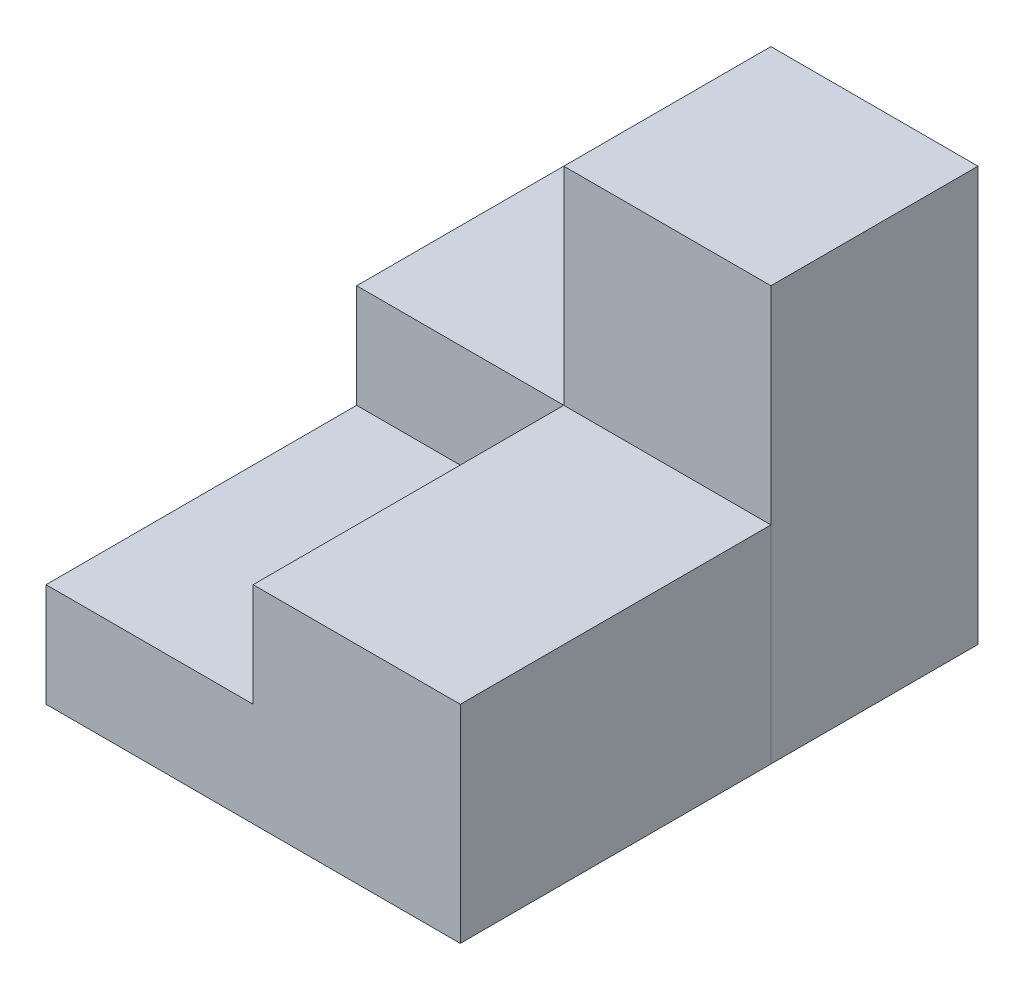
ISO-10303-21;
HEADER;
FILE_DESCRIPTION(('STEP AP214'),'2;1');
FILE_NAME('part.step','',(''),(''),'','','');
FILE_SCHEMA(('AUTOMOTIVE_DESIGN { 1 0 10303 214 1 1 1 1 }'));
ENDSEC;
DATA;
#1=APPLICATION_CONTEXT('core data for automotive mechanical design processes');
#2=APPLICATION_PROTOCOL_DEFINITION('international standard','automotive_design',2000,#1);
#3=PRODUCT_CONTEXT('',#1,'mechanical');
#4=PRODUCT('Part','Part','',(#3));
#5=PRODUCT_RELATED_PRODUCT_CATEGORY('part','',(#4));
#6=PRODUCT_DEFINITION_FORMATION('','',#4);
#7=PRODUCT_DEFINITION_CONTEXT('part definition',#1,'design');
#8=PRODUCT_DEFINITION('design','',#6,#7);
#9=PRODUCT_DEFINITION_SHAPE('','',#8);
#10=(LENGTH_UNIT() NAMED_UNIT(*) SI_UNIT(.MILLI.,.METRE.));
#11=(NAMED_UNIT(*) PLANE_ANGLE_UNIT() SI_UNIT($,.RADIAN.));
#12=(NAMED_UNIT(*) SI_UNIT($,.STERADIAN.) SOLID_ANGLE_UNIT());
#13=UNCERTAINTY_MEASURE_WITH_UNIT(LENGTH_MEASURE(1.E-05),#10,'distance_accuracy_value','');
#14=(GEOMETRIC_REPRESENTATION_CONTEXT(3) GLOBAL_UNCERTAINTY_ASSIGNED_CONTEXT((#13)) GLOBAL_UNIT_ASSIGNED_CONTEXT((#10,
#11,#12)) REPRESENTATION_CONTEXT('',''));
#15=CARTESIAN_POINT('',(0.,0.,0.));
#16=DIRECTION('',(0.,0.,1.));
#17=DIRECTION('',(1.,0.,0.));
#18=AXIS2_PLACEMENT_3D('',#15,#16,#17);
#19=CARTESIAN_POINT('',(0.,40.,0.));
#20=DIRECTION('',(0.,0.,-1.));
#21=DIRECTION('',(-1.,0.,0.));
#22=AXIS2_PLACEMENT_3D('',#19,#20,#21);
#23=PLANE('',#22);
#24=DIRECTION('',(-1.,0.,0.));
#25=VECTOR('',#24,1.);
#26=CARTESIAN_POINT('',(0.,9.99999999999998,0.));
#27=LINE('',#26,#25);
#28=CARTESIAN_POINT('',(0.,9.99999999999998,0.));
#29=VERTEX_POINT('',#28);
#30=CARTESIAN_POINT('',(-20.,9.99999999999998,0.));
#31=VERTEX_POINT('',#30);
#32=EDGE_CURVE('E131',#29,#31,#27,.T.);
#33=ORIENTED_EDGE('',*,*,#32,.F.);
#34=DIRECTION('',(0.,-1.,0.));
#35=VECTOR('',#34,1.);
#36=CARTESIAN_POINT('',(0.,20.,0.));
#37=LINE('',#36,#35);
#38=CARTESIAN_POINT('',(0.,20.,0.));
#39=VERTEX_POINT('',#38);
#40=EDGE_CURVE('E144',#39,#29,#37,.T.);
#41=ORIENTED_EDGE('',*,*,#40,.F.);
#42=DIRECTION('',(1.,0.,0.));
#43=VECTOR('',#42,1.);
#44=CARTESIAN_POINT('',(0.,20.,0.));
#45=LINE('',#44,#43);
#46=CARTESIAN_POINT('',(-20.,20.,0.));
#47=VERTEX_POINT('',#46);
#48=EDGE_CURVE('E176',#47,#39,#45,.T.);
#49=ORIENTED_EDGE('',*,*,#48,.F.);
#50=DIRECTION('',(0.,-1.,0.));
#51=VECTOR('',#50,1.);
#52=CARTESIAN_POINT('',(-20.,20.,0.));
#53=LINE('',#52,#51);
#54=EDGE_CURVE('E146',#47,#31,#53,.T.);
#55=ORIENTED_EDGE('',*,*,#54,.T.);
#56=EDGE_LOOP('',(#33,#41,#49,#55));
#57=FACE_BOUND('',#56,.T.);
#58=ADVANCED_FACE('F37',(#57),#23,.F.);
#59=CARTESIAN_POINT('',(0.,20.,0.));
#60=DIRECTION('',(1.,0.,0.));
#61=DIRECTION('',(0.,0.,-1.));
#62=AXIS2_PLACEMENT_3D('',#59,#60,#61);
#63=PLANE('',#62);
#64=DIRECTION('',(0.,0.,-1.));
#65=VECTOR('',#64,1.);
#66=CARTESIAN_POINT('',(0.,9.99999999999998,0.));
#67=LINE('',#66,#65);
#68=CARTESIAN_POINT('',(0.,9.99999999999998,30.));
#69=VERTEX_POINT('',#68);
#70=EDGE_CURVE('E128',#69,#29,#67,.T.);
#71=ORIENTED_EDGE('',*,*,#70,.F.);
#72=DIRECTION('',(0.,-1.,0.));
#73=VECTOR('',#72,1.);
#74=CARTESIAN_POINT('',(0.,20.,30.));
#75=LINE('',#74,#73);
#76=CARTESIAN_POINT('',(0.,20.,30.));
#77=VERTEX_POINT('',#76);
#78=EDGE_CURVE('E166',#77,#69,#75,.T.);
#79=ORIENTED_EDGE('',*,*,#78,.F.);
#80=DIRECTION('',(0.,0.,1.));
#81=VECTOR('',#80,1.);
#82=CARTESIAN_POINT('',(0.,20.,0.));
#83=LINE('',#82,#81);
#84=EDGE_CURVE('E152',#39,#77,#83,.T.);
#85=ORIENTED_EDGE('',*,*,#84,.F.);
#86=ORIENTED_EDGE('',*,*,#40,.T.);
#87=EDGE_LOOP('',(#71,#79,#85,#86));
#88=FACE_BOUND('',#87,.T.);
#89=ADVANCED_FACE('F150',(#88),#63,.F.);
#90=DIRECTION('',(-1.,0.,0.));
#91=VECTOR('',#90,1.);
#92=CARTESIAN_POINT('',(0.,20.,0.));
#93=LINE('',#92,#91);
#94=CARTESIAN_POINT('',(20.,20.,0.));
#95=VERTEX_POINT('',#94);
#96=EDGE_CURVE('E11',#95,#39,#93,.T.);
#97=ORIENTED_EDGE('',*,*,#96,.F.);
#98=DIRECTION('',(0.,-1.,0.));
#99=VECTOR('',#98,1.);
#100=CARTESIAN_POINT('',(20.,40.,0.));
#101=LINE('',#100,#99);
#102=CARTESIAN_POINT('',(20.,40.,0.));
#103=VERTEX_POINT('',#102);
#104=EDGE_CURVE('E196',#103,#95,#101,.T.);
#105=ORIENTED_EDGE('',*,*,#104,.F.);
#106=DIRECTION('',(1.,0.,0.));
#107=VECTOR('',#106,1.);
#108=CARTESIAN_POINT('',(0.,40.,0.));
#109=LINE('',#108,#107);
#110=CARTESIAN_POINT('',(0.,40.,0.));
#111=VERTEX_POINT('',#110);
#112=EDGE_CURVE('E81',#111,#103,#109,.T.);
#113=ORIENTED_EDGE('',*,*,#112,.F.);
#114=DIRECTION('',(0.,-1.,0.));
#115=VECTOR('',#114,1.);
#116=CARTESIAN_POINT('',(0.,40.,0.));
#117=LINE('',#116,#115);
#118=EDGE_CURVE('E41',#111,#39,#117,.T.);
#119=ORIENTED_EDGE('',*,*,#118,.T.);
#120=EDGE_LOOP('',(#97,#105,#113,#119));
#121=FACE_BOUND('',#120,.T.);
#122=ADVANCED_FACE('F245',(#121),#23,.F.);
#123=CARTESIAN_POINT('',(0.,40.,0.));
#124=DIRECTION('',(1.,0.,0.));
#125=DIRECTION('',(0.,0.,-1.));
#126=AXIS2_PLACEMENT_3D('',#123,#124,#125);
#127=PLANE('',#126);
#128=DIRECTION('',(0.,0.,-1.));
#129=VECTOR('',#128,1.);
#130=CARTESIAN_POINT('',(0.,20.,-20.));
#131=LINE('',#130,#129);
#132=CARTESIAN_POINT('',(0.,20.,-20.));
#133=VERTEX_POINT('',#132);
#134=EDGE_CURVE('E169',#39,#133,#131,.T.);
#135=ORIENTED_EDGE('',*,*,#134,.F.);
#136=ORIENTED_EDGE('',*,*,#118,.F.);
#137=DIRECTION('',(0.,0.,1.));
#138=VECTOR('',#137,1.);
#139=CARTESIAN_POINT('',(0.,40.,0.));
#140=LINE('',#139,#138);
#141=CARTESIAN_POINT('',(0.,40.,-20.));
#142=VERTEX_POINT('',#141);
#143=EDGE_CURVE('E183',#142,#111,#140,.T.);
#144=ORIENTED_EDGE('',*,*,#143,.F.);
#145=DIRECTION('',(0.,-1.,0.));
#146=VECTOR('',#145,1.);
#147=CARTESIAN_POINT('',(0.,40.,-20.));
#148=LINE('',#147,#146);
#149=EDGE_CURVE('E190',#142,#133,#148,.T.);
#150=ORIENTED_EDGE('',*,*,#149,.T.);
#151=EDGE_LOOP('',(#135,#136,#144,#150));
#152=FACE_BOUND('',#151,.T.);
#153=ADVANCED_FACE('F39',(#152),#127,.F.);
#154=CARTESIAN_POINT('',(20.,40.,0.));
#155=DIRECTION('',(-1.,0.,0.));
#156=DIRECTION('',(0.,0.,1.));
#157=AXIS2_PLACEMENT_3D('',#154,#155,#156);
#158=PLANE('',#157);
#159=DIRECTION('',(0.,0.,-1.));
#160=VECTOR('',#159,1.);
#161=CARTESIAN_POINT('',(20.,0.,0.));
#162=LINE('',#161,#160);
#163=CARTESIAN_POINT('',(20.,0.,0.));
#164=VERTEX_POINT('',#163);
#165=CARTESIAN_POINT('',(20.,0.,-20.));
#166=VERTEX_POINT('',#165);
#167=EDGE_CURVE('E76',#164,#166,#162,.T.);
#168=ORIENTED_EDGE('',*,*,#167,.T.);
#169=DIRECTION('',(0.,-1.,0.));
#170=VECTOR('',#169,1.);
#171=CARTESIAN_POINT('',(20.,40.,-20.));
#172=LINE('',#171,#170);
#173=CARTESIAN_POINT('',(20.,40.,-20.));
#174=VERTEX_POINT('',#173);
#175=EDGE_CURVE('E194',#174,#166,#172,.T.);
#176=ORIENTED_EDGE('',*,*,#175,.F.);
#177=DIRECTION('',(0.,0.,-1.));
#178=VECTOR('',#177,1.);
#179=CARTESIAN_POINT('',(20.,40.,0.));
#180=LINE('',#179,#178);
#181=EDGE_CURVE('E187',#103,#174,#180,.T.);
#182=ORIENTED_EDGE('',*,*,#181,.F.);
#183=ORIENTED_EDGE('',*,*,#104,.T.);
#184=EDGE_CURVE('E195',#95,#164,#101,.T.);
#185=ORIENTED_EDGE('',*,*,#184,.T.);
#186=EDGE_LOOP('',(#168,#176,#182,#183,#185));
#187=FACE_BOUND('',#186,.T.);
#188=ADVANCED_FACE('F199',(#187),#158,.F.);
#189=CARTESIAN_POINT('',(0.,40.,-20.));
#190=DIRECTION('',(0.,0.,1.));
#191=DIRECTION('',(1.,0.,0.));
#192=AXIS2_PLACEMENT_3D('',#189,#190,#191);
#193=PLANE('',#192);
#194=DIRECTION('',(-1.,0.,0.));
#195=VECTOR('',#194,1.);
#196=CARTESIAN_POINT('',(0.,0.,-20.));
#197=LINE('',#196,#195);
#198=CARTESIAN_POINT('',(-20.,0.,-20.));
#199=VERTEX_POINT('',#198);
#200=EDGE_CURVE('E185',#166,#199,#197,.T.);
#201=ORIENTED_EDGE('',*,*,#200,.T.);
#202=DIRECTION('',(0.,-1.,0.));
#203=VECTOR('',#202,1.);
#204=CARTESIAN_POINT('',(-20.,20.,-20.));
#205=LINE('',#204,#203);
#206=CARTESIAN_POINT('',(-20.,20.,-20.));
#207=VERTEX_POINT('',#206);
#208=EDGE_CURVE('E180',#207,#199,#205,.T.);
#209=ORIENTED_EDGE('',*,*,#208,.F.);
#210=DIRECTION('',(-1.,0.,0.));
#211=VECTOR('',#210,1.);
#212=CARTESIAN_POINT('',(0.,20.,-20.));
#213=LINE('',#212,#211);
#214=EDGE_CURVE('E172',#133,#207,#213,.T.);
#215=ORIENTED_EDGE('',*,*,#214,.F.);
#216=ORIENTED_EDGE('',*,*,#149,.F.);
#217=DIRECTION('',(-1.,0.,0.));
#218=VECTOR('',#217,1.);
#219=CARTESIAN_POINT('',(0.,40.,-20.));
#220=LINE('',#219,#218);
#221=EDGE_CURVE('E61',#174,#142,#220,.T.);
#222=ORIENTED_EDGE('',*,*,#221,.F.);
#223=ORIENTED_EDGE('',*,*,#175,.T.);
#224=EDGE_LOOP('',(#201,#209,#215,#216,#222,#223));
#225=FACE_BOUND('',#224,.T.);
#226=ADVANCED_FACE('F259',(#225),#193,.F.);
#227=CARTESIAN_POINT('',(0.,40.,0.));
#228=DIRECTION('',(0.,-1.,0.));
#229=DIRECTION('',(0.,0.,-1.));
#230=AXIS2_PLACEMENT_3D('',#227,#228,#229);
#231=PLANE('',#230);
#232=ORIENTED_EDGE('',*,*,#143,.T.);
#233=ORIENTED_EDGE('',*,*,#112,.T.);
#234=ORIENTED_EDGE('',*,*,#181,.T.);
#235=ORIENTED_EDGE('',*,*,#221,.T.);
#236=EDGE_LOOP('',(#232,#233,#234,#235));
#237=FACE_BOUND('',#236,.T.);
#238=ADVANCED_FACE('F268',(#237),#231,.F.);
#239=CARTESIAN_POINT('',(0.,0.,0.));
#240=DIRECTION('',(0.,-1.,0.));
#241=DIRECTION('',(0.,0.,-1.));
#242=AXIS2_PLACEMENT_3D('',#239,#240,#241);
#243=PLANE('',#242);
#244=DIRECTION('',(1.,0.,0.));
#245=VECTOR('',#244,1.);
#246=CARTESIAN_POINT('',(0.,0.,30.));
#247=LINE('',#246,#245);
#248=CARTESIAN_POINT('',(-20.,0.,30.));
#249=VERTEX_POINT('',#248);
#250=CARTESIAN_POINT('',(20.0037720239983,0.,30.));
#251=VERTEX_POINT('',#250);
#252=EDGE_CURVE('E215',#249,#251,#247,.T.);
#253=ORIENTED_EDGE('',*,*,#252,.F.);
#254=DIRECTION('',(0.,0.,1.));
#255=VECTOR('',#254,1.);
#256=CARTESIAN_POINT('',(-20.,0.,-20.));
#257=LINE('',#256,#255);
#258=EDGE_CURVE('E168',#199,#249,#257,.T.);
#259=ORIENTED_EDGE('',*,*,#258,.F.);
#260=ORIENTED_EDGE('',*,*,#200,.F.);
#261=ORIENTED_EDGE('',*,*,#167,.F.);
#262=DIRECTION('',(-1.,0.,0.));
#263=VECTOR('',#262,1.);
#264=CARTESIAN_POINT('',(0.,0.,0.));
#265=LINE('',#264,#263);
#266=CARTESIAN_POINT('',(20.0037720239983,0.,0.));
#267=VERTEX_POINT('',#266);
#268=EDGE_CURVE('E161',#267,#164,#265,.T.);
#269=ORIENTED_EDGE('',*,*,#268,.F.);
#270=DIRECTION('',(0.,0.,-1.));
#271=VECTOR('',#270,1.);
#272=CARTESIAN_POINT('',(20.0037720239983,0.,0.));
#273=LINE('',#272,#271);
#274=EDGE_CURVE('E212',#251,#267,#273,.T.);
#275=ORIENTED_EDGE('',*,*,#274,.F.);
#276=EDGE_LOOP('',(#253,#259,#260,#261,#269,#275));
#277=FACE_BOUND('',#276,.T.);
#278=ADVANCED_FACE('F207',(#277),#243,.T.);
#279=CARTESIAN_POINT('',(-20.,20.,-20.));
#280=DIRECTION('',(1.,0.,0.));
#281=DIRECTION('',(0.,0.,-1.));
#282=AXIS2_PLACEMENT_3D('',#279,#280,#281);
#283=PLANE('',#282);
#284=ORIENTED_EDGE('',*,*,#258,.T.);
#285=DIRECTION('',(0.,-1.,0.));
#286=VECTOR('',#285,1.);
#287=CARTESIAN_POINT('',(-20.,9.99999999999998,30.));
#288=LINE('',#287,#286);
#289=CARTESIAN_POINT('',(-20.,9.99999999999998,30.));
#290=VERTEX_POINT('',#289);
#291=EDGE_CURVE('E217',#290,#249,#288,.T.);
#292=ORIENTED_EDGE('',*,*,#291,.F.);
#293=DIRECTION('',(0.,0.,1.));
#294=VECTOR('',#293,1.);
#295=CARTESIAN_POINT('',(-20.,9.99999999999998,0.));
#296=LINE('',#295,#294);
#297=EDGE_CURVE('E147',#31,#290,#296,.T.);
#298=ORIENTED_EDGE('',*,*,#297,.F.);
#299=ORIENTED_EDGE('',*,*,#54,.F.);
#300=DIRECTION('',(0.,0.,1.));
#301=VECTOR('',#300,1.);
#302=CARTESIAN_POINT('',(-20.,20.,-20.));
#303=LINE('',#302,#301);
#304=EDGE_CURVE('E174',#207,#47,#303,.T.);
#305=ORIENTED_EDGE('',*,*,#304,.F.);
#306=ORIENTED_EDGE('',*,*,#208,.T.);
#307=EDGE_LOOP('',(#284,#292,#298,#299,#305,#306));
#308=FACE_BOUND('',#307,.T.);
#309=ADVANCED_FACE('F227',(#308),#283,.F.);
#310=CARTESIAN_POINT('',(0.,20.,0.));
#311=DIRECTION('',(0.,-1.,0.));
#312=DIRECTION('',(0.,0.,-1.));
#313=AXIS2_PLACEMENT_3D('',#310,#311,#312);
#314=PLANE('',#313);
#315=ORIENTED_EDGE('',*,*,#134,.T.);
#316=ORIENTED_EDGE('',*,*,#214,.T.);
#317=ORIENTED_EDGE('',*,*,#304,.T.);
#318=ORIENTED_EDGE('',*,*,#48,.T.);
#319=EDGE_LOOP('',(#315,#316,#317,#318));
#320=FACE_BOUND('',#319,.T.);
#321=ADVANCED_FACE('F242',(#320),#314,.F.);
#322=CARTESIAN_POINT('',(0.,20.,30.));
#323=DIRECTION('',(0.,0.,-1.));
#324=DIRECTION('',(-1.,0.,0.));
#325=AXIS2_PLACEMENT_3D('',#322,#323,#324);
#326=PLANE('',#325);
#327=ORIENTED_EDGE('',*,*,#252,.T.);
#328=DIRECTION('',(0.,-1.,0.));
#329=VECTOR('',#328,1.);
#330=CARTESIAN_POINT('',(20.0037720239983,20.,30.));
#331=LINE('',#330,#329);
#332=CARTESIAN_POINT('',(20.0037720239983,20.,30.));
#333=VERTEX_POINT('',#332);
#334=EDGE_CURVE('E156',#333,#251,#331,.T.);
#335=ORIENTED_EDGE('',*,*,#334,.F.);
#336=DIRECTION('',(1.,0.,0.));
#337=VECTOR('',#336,1.);
#338=CARTESIAN_POINT('',(0.,20.,30.));
#339=LINE('',#338,#337);
#340=EDGE_CURVE('E213',#77,#333,#339,.T.);
#341=ORIENTED_EDGE('',*,*,#340,.F.);
#342=ORIENTED_EDGE('',*,*,#78,.T.);
#343=DIRECTION('',(1.,0.,0.));
#344=VECTOR('',#343,1.);
#345=CARTESIAN_POINT('',(0.,9.99999999999998,30.));
#346=LINE('',#345,#344);
#347=EDGE_CURVE('E134',#290,#69,#346,.T.);
#348=ORIENTED_EDGE('',*,*,#347,.F.);
#349=ORIENTED_EDGE('',*,*,#291,.T.);
#350=EDGE_LOOP('',(#327,#335,#341,#342,#348,#349));
#351=FACE_BOUND('',#350,.T.);
#352=ADVANCED_FACE('F229',(#351),#326,.F.);
#353=CARTESIAN_POINT('',(20.0037720239983,20.,0.));
#354=DIRECTION('',(-1.,0.,0.));
#355=DIRECTION('',(0.,0.,1.));
#356=AXIS2_PLACEMENT_3D('',#353,#354,#355);
#357=PLANE('',#356);
#358=ORIENTED_EDGE('',*,*,#274,.T.);
#359=DIRECTION('',(0.,-1.,0.));
#360=VECTOR('',#359,1.);
#361=CARTESIAN_POINT('',(20.0037720239983,20.,0.));
#362=LINE('',#361,#360);
#363=CARTESIAN_POINT('',(20.0037720239983,20.,0.));
#364=VERTEX_POINT('',#363);
#365=EDGE_CURVE('E153',#364,#267,#362,.T.);
#366=ORIENTED_EDGE('',*,*,#365,.F.);
#367=DIRECTION('',(0.,0.,-1.));
#368=VECTOR('',#367,1.);
#369=CARTESIAN_POINT('',(20.0037720239983,20.,0.));
#370=LINE('',#369,#368);
#371=EDGE_CURVE('E159',#333,#364,#370,.T.);
#372=ORIENTED_EDGE('',*,*,#371,.F.);
#373=ORIENTED_EDGE('',*,*,#334,.T.);
#374=EDGE_LOOP('',(#358,#366,#372,#373));
#375=FACE_BOUND('',#374,.T.);
#376=ADVANCED_FACE('F234',(#375),#357,.F.);
#377=CARTESIAN_POINT('',(0.,20.,0.));
#378=DIRECTION('',(0.,0.,1.));
#379=DIRECTION('',(1.,0.,0.));
#380=AXIS2_PLACEMENT_3D('',#377,#378,#379);
#381=PLANE('',#380);
#382=ORIENTED_EDGE('',*,*,#184,.F.);
#383=EDGE_CURVE('E47',#364,#95,#93,.T.);
#384=ORIENTED_EDGE('',*,*,#383,.F.);
#385=ORIENTED_EDGE('',*,*,#365,.T.);
#386=ORIENTED_EDGE('',*,*,#268,.T.);
#387=EDGE_LOOP('',(#382,#384,#385,#386));
#388=FACE_BOUND('',#387,.T.);
#389=ADVANCED_FACE('F210',(#388),#381,.F.);
#390=CARTESIAN_POINT('',(0.,20.,0.));
#391=DIRECTION('',(0.,1.,0.));
#392=DIRECTION('',(0.,0.,1.));
#393=AXIS2_PLACEMENT_3D('',#390,#391,#392);
#394=PLANE('',#393);
#395=ORIENTED_EDGE('',*,*,#84,.T.);
#396=ORIENTED_EDGE('',*,*,#340,.T.);
#397=ORIENTED_EDGE('',*,*,#371,.T.);
#398=ORIENTED_EDGE('',*,*,#383,.T.);
#399=ORIENTED_EDGE('',*,*,#96,.T.);
#400=EDGE_LOOP('',(#395,#396,#397,#398,#399));
#401=FACE_BOUND('',#400,.T.);
#402=ADVANCED_FACE('F233',(#401),#394,.T.);
#403=CARTESIAN_POINT('',(0.,9.99999999999998,0.));
#404=DIRECTION('',(0.,-1.,0.));
#405=DIRECTION('',(0.,0.,-1.));
#406=AXIS2_PLACEMENT_3D('',#403,#404,#405);
#407=PLANE('',#406);
#408=ORIENTED_EDGE('',*,*,#70,.T.);
#409=ORIENTED_EDGE('',*,*,#32,.T.);
#410=ORIENTED_EDGE('',*,*,#297,.T.);
#411=ORIENTED_EDGE('',*,*,#347,.T.);
#412=EDGE_LOOP('',(#408,#409,#410,#411));
#413=FACE_BOUND('',#412,.T.);
#414=ADVANCED_FACE('F130',(#413),#407,.F.);
#415=CLOSED_SHELL('',(#58,#89,#122,#153,#188,#226,#238,#278,#309,#321,#352,#376,#389,#402,#414));
#416=MANIFOLD_SOLID_BREP('B2',#415);
#417=ADVANCED_BREP_SHAPE_REPRESENTATION('',(#18,#416),#14);
#418=SHAPE_DEFINITION_REPRESENTATION(#9,#417);
ENDSEC;
END-ISO-10303-21;
